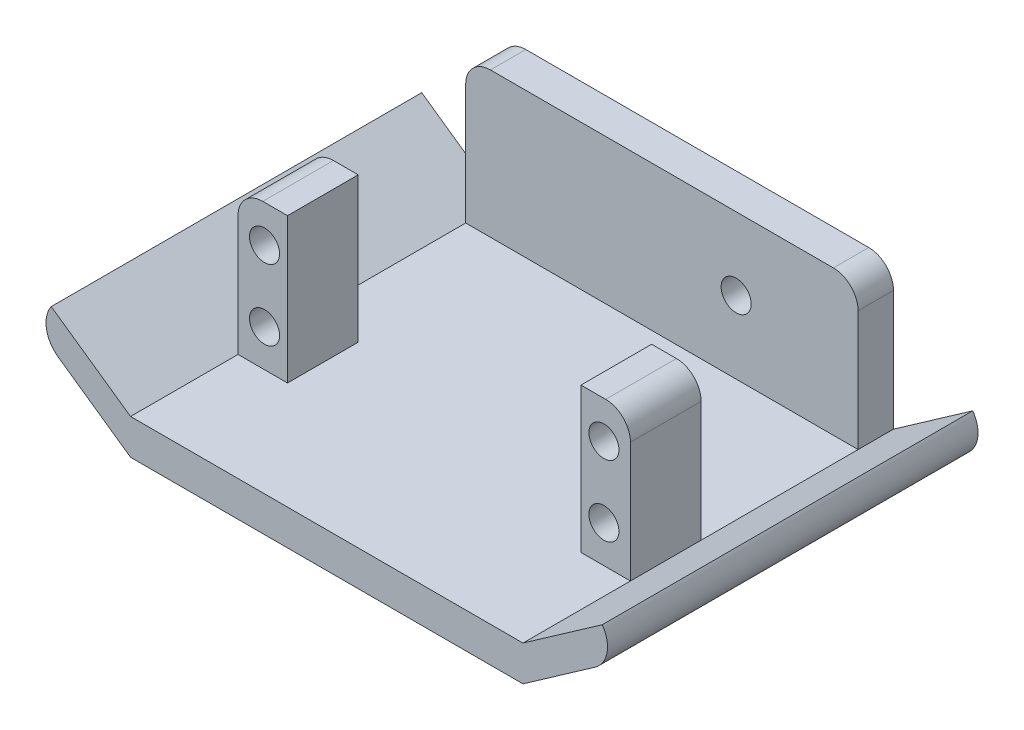
ISO-10303-21;
HEADER;
FILE_DESCRIPTION(('STEP AP214'),'2;1');
FILE_NAME('part.step','',(''),(''),'','','');
FILE_SCHEMA(('AUTOMOTIVE_DESIGN { 1 0 10303 214 1 1 1 1 }'));
ENDSEC;
DATA;
#1=APPLICATION_CONTEXT('core data for automotive mechanical design processes');
#2=APPLICATION_PROTOCOL_DEFINITION('international standard','automotive_design',2000,#1);
#3=PRODUCT_CONTEXT('',#1,'mechanical');
#4=PRODUCT('Part','Part','',(#3));
#5=PRODUCT_RELATED_PRODUCT_CATEGORY('part','',(#4));
#6=PRODUCT_DEFINITION_FORMATION('','',#4);
#7=PRODUCT_DEFINITION_CONTEXT('part definition',#1,'design');
#8=PRODUCT_DEFINITION('design','',#6,#7);
#9=PRODUCT_DEFINITION_SHAPE('','',#8);
#10=(LENGTH_UNIT() NAMED_UNIT(*) SI_UNIT(.MILLI.,.METRE.));
#11=(NAMED_UNIT(*) PLANE_ANGLE_UNIT() SI_UNIT($,.RADIAN.));
#12=(NAMED_UNIT(*) SI_UNIT($,.STERADIAN.) SOLID_ANGLE_UNIT());
#13=UNCERTAINTY_MEASURE_WITH_UNIT(LENGTH_MEASURE(1.E-05),#10,'distance_accuracy_value','');
#14=(GEOMETRIC_REPRESENTATION_CONTEXT(3) GLOBAL_UNCERTAINTY_ASSIGNED_CONTEXT((#13)) GLOBAL_UNIT_ASSIGNED_CONTEXT((#10,
#11,#12)) REPRESENTATION_CONTEXT('',''));
#15=CARTESIAN_POINT('',(0.,0.,0.));
#16=DIRECTION('',(0.,0.,1.));
#17=DIRECTION('',(1.,0.,0.));
#18=AXIS2_PLACEMENT_3D('',#15,#16,#17);
#19=CARTESIAN_POINT('',(55.5,5.,0.));
#20=DIRECTION('',(-1.,0.,0.));
#21=DIRECTION('',(0.,0.,1.));
#22=AXIS2_PLACEMENT_3D('',#19,#20,#21);
#23=PLANE('',#22);
#24=DIRECTION('',(0.,-1.,0.));
#25=VECTOR('',#24,1.);
#26=CARTESIAN_POINT('',(55.5,5.,-40.4));
#27=LINE('',#26,#25);
#28=CARTESIAN_POINT('',(55.5,22.,-40.4));
#29=VERTEX_POINT('',#28);
#30=CARTESIAN_POINT('',(55.5,5.,-40.4));
#31=VERTEX_POINT('',#30);
#32=EDGE_CURVE('E376',#29,#31,#27,.T.);
#33=ORIENTED_EDGE('',*,*,#32,.F.);
#34=DIRECTION('',(0.,0.,-1.));
#35=VECTOR('',#34,1.);
#36=CARTESIAN_POINT('',(55.5,22.,-35.4));
#37=LINE('',#36,#35);
#38=CARTESIAN_POINT('',(55.5,22.,-35.4));
#39=VERTEX_POINT('',#38);
#40=EDGE_CURVE('E387',#29,#39,#37,.F.);
#41=ORIENTED_EDGE('',*,*,#40,.T.);
#42=DIRECTION('',(0.,-1.,0.));
#43=VECTOR('',#42,1.);
#44=CARTESIAN_POINT('',(55.5,0.,-35.4));
#45=LINE('',#44,#43);
#46=CARTESIAN_POINT('',(55.5,5.,-35.4));
#47=VERTEX_POINT('',#46);
#48=EDGE_CURVE('E350',#39,#47,#45,.T.);
#49=ORIENTED_EDGE('',*,*,#48,.T.);
#50=DIRECTION('',(0.,0.,1.));
#51=VECTOR('',#50,1.);
#52=CARTESIAN_POINT('',(55.5,5.,-57.9564078321223));
#53=LINE('',#52,#51);
#54=EDGE_CURVE('E300',#31,#47,#53,.T.);
#55=ORIENTED_EDGE('',*,*,#54,.F.);
#56=EDGE_LOOP('',(#33,#41,#49,#55));
#57=FACE_BOUND('',#56,.T.);
#58=ADVANCED_FACE('F38',(#57),#23,.F.);
#59=DIRECTION('',(0.,1.,0.));
#60=VECTOR('',#59,1.);
#61=CARTESIAN_POINT('',(55.5,25.5,-3.2));
#62=LINE('',#61,#60);
#63=CARTESIAN_POINT('',(55.5,5.,-3.2));
#64=VERTEX_POINT('',#63);
#65=CARTESIAN_POINT('',(55.5,22.,-3.2));
#66=VERTEX_POINT('',#65);
#67=EDGE_CURVE('E322',#64,#66,#62,.T.);
#68=ORIENTED_EDGE('',*,*,#67,.F.);
#69=DIRECTION('',(0.,0.,-1.));
#70=VECTOR('',#69,1.);
#71=CARTESIAN_POINT('',(55.5,5.,0.));
#72=LINE('',#71,#70);
#73=CARTESIAN_POINT('',(55.5,5.,-13.2));
#74=VERTEX_POINT('',#73);
#75=EDGE_CURVE('E370',#64,#74,#72,.T.);
#76=ORIENTED_EDGE('',*,*,#75,.T.);
#77=DIRECTION('',(0.,-1.,0.));
#78=VECTOR('',#77,1.);
#79=CARTESIAN_POINT('',(55.5,22.,-13.2));
#80=LINE('',#79,#78);
#81=CARTESIAN_POINT('',(55.5,22.,-13.2));
#82=VERTEX_POINT('',#81);
#83=EDGE_CURVE('E272',#82,#74,#80,.T.);
#84=ORIENTED_EDGE('',*,*,#83,.F.);
#85=DIRECTION('',(0.,0.,-1.));
#86=VECTOR('',#85,1.);
#87=CARTESIAN_POINT('',(55.5,22.,0.));
#88=LINE('',#87,#86);
#89=EDGE_CURVE('E395',#82,#66,#88,.F.);
#90=ORIENTED_EDGE('',*,*,#89,.T.);
#91=EDGE_LOOP('',(#68,#76,#84,#90));
#92=FACE_BOUND('',#91,.T.);
#93=ADVANCED_FACE('F452',(#92),#23,.F.);
#94=CARTESIAN_POINT('',(0.,5.,0.));
#95=DIRECTION('',(1.,0.,0.));
#96=DIRECTION('',(0.,0.,-1.));
#97=AXIS2_PLACEMENT_3D('',#94,#95,#96);
#98=PLANE('',#97);
#99=DIRECTION('',(0.,1.,0.));
#100=VECTOR('',#99,1.);
#101=CARTESIAN_POINT('',(0.,0.,-35.4));
#102=LINE('',#101,#100);
#103=CARTESIAN_POINT('',(0.,5.,-35.4));
#104=VERTEX_POINT('',#103);
#105=CARTESIAN_POINT('',(0.,22.,-35.4));
#106=VERTEX_POINT('',#105);
#107=EDGE_CURVE('E353',#104,#106,#102,.T.);
#108=ORIENTED_EDGE('',*,*,#107,.T.);
#109=DIRECTION('',(0.,0.,-1.));
#110=VECTOR('',#109,1.);
#111=CARTESIAN_POINT('',(0.,22.,-40.4));
#112=LINE('',#111,#110);
#113=CARTESIAN_POINT('',(0.,22.,-40.4));
#114=VERTEX_POINT('',#113);
#115=EDGE_CURVE('E399',#106,#114,#112,.T.);
#116=ORIENTED_EDGE('',*,*,#115,.T.);
#117=DIRECTION('',(0.,-1.,0.));
#118=VECTOR('',#117,1.);
#119=CARTESIAN_POINT('',(0.,5.,-40.4));
#120=LINE('',#119,#118);
#121=CARTESIAN_POINT('',(0.,5.,-40.4));
#122=VERTEX_POINT('',#121);
#123=EDGE_CURVE('E369',#114,#122,#120,.T.);
#124=ORIENTED_EDGE('',*,*,#123,.T.);
#125=DIRECTION('',(0.,0.,1.));
#126=VECTOR('',#125,1.);
#127=CARTESIAN_POINT('',(0.,5.,-57.9564078321223));
#128=LINE('',#127,#126);
#129=EDGE_CURVE('E309',#122,#104,#128,.T.);
#130=ORIENTED_EDGE('',*,*,#129,.T.);
#131=EDGE_LOOP('',(#108,#116,#124,#130));
#132=FACE_BOUND('',#131,.T.);
#133=ADVANCED_FACE('F430',(#132),#98,.F.);
#134=CARTESIAN_POINT('',(0.,5.,0.));
#135=DIRECTION('',(0.,-1.,0.));
#136=DIRECTION('',(0.,0.,-1.));
#137=AXIS2_PLACEMENT_3D('',#134,#135,#136);
#138=PLANE('',#137);
#139=DIRECTION('',(0.,0.,1.));
#140=VECTOR('',#139,1.);
#141=CARTESIAN_POINT('',(0.,5.,0.));
#142=LINE('',#141,#140);
#143=CARTESIAN_POINT('',(0.,5.,-13.2));
#144=VERTEX_POINT('',#143);
#145=EDGE_CURVE('E363',#104,#144,#142,.T.);
#146=ORIENTED_EDGE('',*,*,#145,.T.);
#147=DIRECTION('',(-1.,0.,0.));
#148=VECTOR('',#147,1.);
#149=CARTESIAN_POINT('',(7.,5.,-13.2));
#150=LINE('',#149,#148);
#151=CARTESIAN_POINT('',(7.,5.,-13.2));
#152=VERTEX_POINT('',#151);
#153=EDGE_CURVE('E242',#152,#144,#150,.T.);
#154=ORIENTED_EDGE('',*,*,#153,.F.);
#155=DIRECTION('',(0.,0.,-1.));
#156=VECTOR('',#155,1.);
#157=CARTESIAN_POINT('',(7.,5.,-3.2));
#158=LINE('',#157,#156);
#159=CARTESIAN_POINT('',(7.,5.,-3.2));
#160=VERTEX_POINT('',#159);
#161=EDGE_CURVE('E53',#160,#152,#158,.T.);
#162=ORIENTED_EDGE('',*,*,#161,.F.);
#163=DIRECTION('',(1.,0.,0.));
#164=VECTOR('',#163,1.);
#165=CARTESIAN_POINT('',(0.,5.,-3.2));
#166=LINE('',#165,#164);
#167=CARTESIAN_POINT('',(0.,5.,-3.2));
#168=VERTEX_POINT('',#167);
#169=EDGE_CURVE('E338',#168,#160,#166,.T.);
#170=ORIENTED_EDGE('',*,*,#169,.F.);
#171=CARTESIAN_POINT('',(0.,5.,12.));
#172=VERTEX_POINT('',#171);
#173=EDGE_CURVE('E366',#168,#172,#142,.T.);
#174=ORIENTED_EDGE('',*,*,#173,.T.);
#175=DIRECTION('',(-1.,0.,0.));
#176=VECTOR('',#175,1.);
#177=CARTESIAN_POINT('',(55.5,5.,12.));
#178=LINE('',#177,#176);
#179=CARTESIAN_POINT('',(55.5,5.,12.));
#180=VERTEX_POINT('',#179);
#181=EDGE_CURVE('E230',#180,#172,#178,.T.);
#182=ORIENTED_EDGE('',*,*,#181,.F.);
#183=EDGE_CURVE('E367',#180,#64,#72,.T.);
#184=ORIENTED_EDGE('',*,*,#183,.T.);
#185=DIRECTION('',(1.,0.,0.));
#186=VECTOR('',#185,1.);
#187=CARTESIAN_POINT('',(55.5,5.,-3.2));
#188=LINE('',#187,#186);
#189=CARTESIAN_POINT('',(48.5,5.,-3.2));
#190=VERTEX_POINT('',#189);
#191=EDGE_CURVE('E329',#190,#64,#188,.T.);
#192=ORIENTED_EDGE('',*,*,#191,.F.);
#193=DIRECTION('',(0.,0.,-1.));
#194=VECTOR('',#193,1.);
#195=CARTESIAN_POINT('',(48.5,5.,-3.2));
#196=LINE('',#195,#194);
#197=CARTESIAN_POINT('',(48.5,5.,-13.2));
#198=VERTEX_POINT('',#197);
#199=EDGE_CURVE('E332',#190,#198,#196,.T.);
#200=ORIENTED_EDGE('',*,*,#199,.T.);
#201=DIRECTION('',(-1.,0.,0.));
#202=VECTOR('',#201,1.);
#203=CARTESIAN_POINT('',(55.5,5.,-13.2));
#204=LINE('',#203,#202);
#205=EDGE_CURVE('E275',#74,#198,#204,.T.);
#206=ORIENTED_EDGE('',*,*,#205,.F.);
#207=EDGE_CURVE('E365',#74,#47,#72,.T.);
#208=ORIENTED_EDGE('',*,*,#207,.T.);
#209=DIRECTION('',(-1.,0.,0.));
#210=VECTOR('',#209,1.);
#211=CARTESIAN_POINT('',(0.,5.,-35.4));
#212=LINE('',#211,#210);
#213=EDGE_CURVE('E205',#47,#104,#212,.T.);
#214=ORIENTED_EDGE('',*,*,#213,.T.);
#215=EDGE_LOOP('',(#146,#154,#162,#170,#174,#182,#184,#192,#200,#206,#208,#214));
#216=FACE_BOUND('',#215,.T.);
#217=ADVANCED_FACE('F422',(#216),#138,.F.);
#218=DIRECTION('',(0.,-1.,0.));
#219=VECTOR('',#218,1.);
#220=CARTESIAN_POINT('',(0.,25.5,-3.2));
#221=LINE('',#220,#219);
#222=CARTESIAN_POINT('',(0.,22.,-3.2));
#223=VERTEX_POINT('',#222);
#224=EDGE_CURVE('E336',#223,#168,#221,.T.);
#225=ORIENTED_EDGE('',*,*,#224,.F.);
#226=DIRECTION('',(0.,0.,-1.));
#227=VECTOR('',#226,1.);
#228=CARTESIAN_POINT('',(0.,22.,0.));
#229=LINE('',#228,#227);
#230=CARTESIAN_POINT('',(0.,22.,-13.2));
#231=VERTEX_POINT('',#230);
#232=EDGE_CURVE('E402',#223,#231,#229,.T.);
#233=ORIENTED_EDGE('',*,*,#232,.T.);
#234=DIRECTION('',(0.,1.,0.));
#235=VECTOR('',#234,1.);
#236=CARTESIAN_POINT('',(0.,5.,-13.2));
#237=LINE('',#236,#235);
#238=EDGE_CURVE('E245',#144,#231,#237,.T.);
#239=ORIENTED_EDGE('',*,*,#238,.F.);
#240=EDGE_CURVE('E61',#144,#168,#128,.T.);
#241=ORIENTED_EDGE('',*,*,#240,.T.);
#242=EDGE_LOOP('',(#225,#233,#239,#241));
#243=FACE_BOUND('',#242,.T.);
#244=ADVANCED_FACE('F417',(#243),#98,.F.);
#245=CARTESIAN_POINT('',(0.,5.,-40.4));
#246=DIRECTION('',(0.,0.,1.));
#247=DIRECTION('',(1.,0.,0.));
#248=AXIS2_PLACEMENT_3D('',#245,#246,#247);
#249=PLANE('',#248);
#250=CARTESIAN_POINT('',(38.25,15.25,-40.4));
#251=DIRECTION('',(0.,0.,1.));
#252=DIRECTION('',(1.,0.,0.));
#253=AXIS2_PLACEMENT_3D('',#250,#251,#252);
#254=CIRCLE('',#253,2.125);
#255=CARTESIAN_POINT('',(40.375,15.25,-40.4));
#256=VERTEX_POINT('',#255);
#257=EDGE_CURVE('E279',#256,#256,#254,.T.);
#258=ORIENTED_EDGE('',*,*,#257,.T.);
#259=EDGE_LOOP('',(#258));
#260=FACE_BOUND('',#259,.T.);
#261=DIRECTION('',(1.,0.,0.));
#262=VECTOR('',#261,1.);
#263=CARTESIAN_POINT('',(55.5,25.5,-40.4));
#264=LINE('',#263,#262);
#265=CARTESIAN_POINT('',(3.5,25.5,-40.4));
#266=VERTEX_POINT('',#265);
#267=CARTESIAN_POINT('',(52.,25.5,-40.4));
#268=VERTEX_POINT('',#267);
#269=EDGE_CURVE('E349',#266,#268,#264,.T.);
#270=ORIENTED_EDGE('',*,*,#269,.T.);
#271=CARTESIAN_POINT('',(52.,22.,-40.4));
#272=DIRECTION('',(0.,0.,1.));
#273=DIRECTION('',(1.,0.,0.));
#274=AXIS2_PLACEMENT_3D('',#271,#272,#273);
#275=CIRCLE('',#274,3.5);
#276=EDGE_CURVE('E385',#268,#29,#275,.F.);
#277=ORIENTED_EDGE('',*,*,#276,.T.);
#278=ORIENTED_EDGE('',*,*,#32,.T.);
#279=DIRECTION('',(0.819152044288995,0.573576436351041,0.));
#280=VECTOR('',#279,1.);
#281=CARTESIAN_POINT('',(55.5,5.,-40.4));
#282=LINE('',#281,#280);
#283=CARTESIAN_POINT('',(66.7181745148335,12.8550503602383,-40.4));
#284=VERTEX_POINT('',#283);
#285=EDGE_CURVE('E299',#31,#284,#282,.T.);
#286=ORIENTED_EDGE('',*,*,#285,.T.);
#287=CARTESIAN_POINT('',(63.3572210864302,10.5068612528074,-40.4));
#288=DIRECTION('',(0.,0.,1.));
#289=DIRECTION('',(1.,0.,0.));
#290=AXIS2_PLACEMENT_3D('',#287,#288,#289);
#291=CIRCLE('',#290,4.10000000392109);
#292=CARTESIAN_POINT('',(65.7088844777185,7.14833786801052,-40.4));
#293=VERTEX_POINT('',#292);
#294=EDGE_CURVE('E297',#284,#293,#291,.F.);
#295=ORIENTED_EDGE('',*,*,#294,.T.);
#296=DIRECTION('',(-0.819152044288995,-0.573576436351042,0.));
#297=VECTOR('',#296,1.);
#298=CARTESIAN_POINT('',(55.5,0.,-40.4));
#299=LINE('',#298,#297);
#300=CARTESIAN_POINT('',(55.5,0.,-40.4));
#301=VERTEX_POINT('',#300);
#302=EDGE_CURVE('E302',#293,#301,#299,.T.);
#303=ORIENTED_EDGE('',*,*,#302,.T.);
#304=DIRECTION('',(-1.,0.,0.));
#305=VECTOR('',#304,1.);
#306=CARTESIAN_POINT('',(0.,0.,-40.4));
#307=LINE('',#306,#305);
#308=CARTESIAN_POINT('',(0.,0.,-40.4));
#309=VERTEX_POINT('',#308);
#310=EDGE_CURVE('E373',#301,#309,#307,.T.);
#311=ORIENTED_EDGE('',*,*,#310,.T.);
#312=DIRECTION('',(-0.819152044288995,0.573576436351041,0.));
#313=VECTOR('',#312,1.);
#314=CARTESIAN_POINT('',(0.,0.,-40.4));
#315=LINE('',#314,#313);
#316=CARTESIAN_POINT('',(-10.2088844777185,7.14833786801052,-40.4));
#317=VERTEX_POINT('',#316);
#318=EDGE_CURVE('E200',#309,#317,#315,.T.);
#319=ORIENTED_EDGE('',*,*,#318,.T.);
#320=CARTESIAN_POINT('',(-7.85722108643022,10.5068612528074,-40.4));
#321=DIRECTION('',(0.,0.,1.));
#322=DIRECTION('',(1.,0.,0.));
#323=AXIS2_PLACEMENT_3D('',#320,#321,#322);
#324=CIRCLE('',#323,4.10000000392109);
#325=CARTESIAN_POINT('',(-11.2181745148335,12.8550503602383,-40.4));
#326=VERTEX_POINT('',#325);
#327=EDGE_CURVE('E310',#317,#326,#324,.F.);
#328=ORIENTED_EDGE('',*,*,#327,.T.);
#329=DIRECTION('',(0.819152044288995,-0.573576436351041,0.));
#330=VECTOR('',#329,1.);
#331=CARTESIAN_POINT('',(0.,5.,-40.4));
#332=LINE('',#331,#330);
#333=EDGE_CURVE('E314',#326,#122,#332,.T.);
#334=ORIENTED_EDGE('',*,*,#333,.T.);
#335=ORIENTED_EDGE('',*,*,#123,.F.);
#336=CARTESIAN_POINT('',(3.5,22.,-40.4));
#337=DIRECTION('',(0.,0.,1.));
#338=DIRECTION('',(1.,0.,0.));
#339=AXIS2_PLACEMENT_3D('',#336,#337,#338);
#340=CIRCLE('',#339,3.5);
#341=EDGE_CURVE('E383',#114,#266,#340,.F.);
#342=ORIENTED_EDGE('',*,*,#341,.T.);
#343=EDGE_LOOP('',(#270,#277,#278,#286,#295,#303,#311,#319,#328,#334,#335,#342));
#344=FACE_BOUND('',#343,.T.);
#345=ADVANCED_FACE('F434',(#260,#344),#249,.F.);
#346=CARTESIAN_POINT('',(0.,0.,0.));
#347=DIRECTION('',(0.,-1.,0.));
#348=DIRECTION('',(0.,0.,-1.));
#349=AXIS2_PLACEMENT_3D('',#346,#347,#348);
#350=PLANE('',#349);
#351=DIRECTION('',(0.,0.,-1.));
#352=VECTOR('',#351,1.);
#353=CARTESIAN_POINT('',(55.5,0.,0.));
#354=LINE('',#353,#352);
#355=CARTESIAN_POINT('',(55.5,0.,12.));
#356=VERTEX_POINT('',#355);
#357=EDGE_CURVE('E204',#356,#301,#354,.T.);
#358=ORIENTED_EDGE('',*,*,#357,.F.);
#359=DIRECTION('',(1.,0.,0.));
#360=VECTOR('',#359,1.);
#361=CARTESIAN_POINT('',(0.,0.,12.));
#362=LINE('',#361,#360);
#363=CARTESIAN_POINT('',(0.,0.,12.));
#364=VERTEX_POINT('',#363);
#365=EDGE_CURVE('E208',#364,#356,#362,.T.);
#366=ORIENTED_EDGE('',*,*,#365,.F.);
#367=DIRECTION('',(0.,0.,1.));
#368=VECTOR('',#367,1.);
#369=CARTESIAN_POINT('',(0.,0.,0.));
#370=LINE('',#369,#368);
#371=EDGE_CURVE('E194',#309,#364,#370,.T.);
#372=ORIENTED_EDGE('',*,*,#371,.F.);
#373=ORIENTED_EDGE('',*,*,#310,.F.);
#374=EDGE_LOOP('',(#358,#366,#372,#373));
#375=FACE_BOUND('',#374,.T.);
#376=ADVANCED_FACE('F209',(#375),#350,.T.);
#377=CARTESIAN_POINT('',(0.,0.,-35.4));
#378=DIRECTION('',(0.,0.,1.));
#379=DIRECTION('',(1.,0.,0.));
#380=AXIS2_PLACEMENT_3D('',#377,#378,#379);
#381=PLANE('',#380);
#382=CARTESIAN_POINT('',(38.25,15.25,-35.4));
#383=DIRECTION('',(0.,0.,1.));
#384=DIRECTION('',(1.,0.,0.));
#385=AXIS2_PLACEMENT_3D('',#382,#383,#384);
#386=CIRCLE('',#385,2.125);
#387=CARTESIAN_POINT('',(40.375,15.25,-35.4));
#388=VERTEX_POINT('',#387);
#389=EDGE_CURVE('E278',#388,#388,#386,.T.);
#390=ORIENTED_EDGE('',*,*,#389,.F.);
#391=EDGE_LOOP('',(#390));
#392=FACE_BOUND('',#391,.T.);
#393=ORIENTED_EDGE('',*,*,#48,.F.);
#394=CARTESIAN_POINT('',(52.,22.,-35.4));
#395=DIRECTION('',(0.,0.,1.));
#396=DIRECTION('',(1.,0.,0.));
#397=AXIS2_PLACEMENT_3D('',#394,#395,#396);
#398=CIRCLE('',#397,3.5);
#399=CARTESIAN_POINT('',(52.,25.5,-35.4));
#400=VERTEX_POINT('',#399);
#401=EDGE_CURVE('E391',#39,#400,#398,.T.);
#402=ORIENTED_EDGE('',*,*,#401,.T.);
#403=DIRECTION('',(1.,0.,0.));
#404=VECTOR('',#403,1.);
#405=CARTESIAN_POINT('',(55.5,25.5,-35.4));
#406=LINE('',#405,#404);
#407=CARTESIAN_POINT('',(3.5,25.5,-35.4));
#408=VERTEX_POINT('',#407);
#409=EDGE_CURVE('E356',#408,#400,#406,.T.);
#410=ORIENTED_EDGE('',*,*,#409,.F.);
#411=CARTESIAN_POINT('',(3.5,22.,-35.4));
#412=DIRECTION('',(0.,0.,1.));
#413=DIRECTION('',(1.,0.,0.));
#414=AXIS2_PLACEMENT_3D('',#411,#412,#413);
#415=CIRCLE('',#414,3.5);
#416=EDGE_CURVE('E389',#408,#106,#415,.T.);
#417=ORIENTED_EDGE('',*,*,#416,.T.);
#418=ORIENTED_EDGE('',*,*,#107,.F.);
#419=ORIENTED_EDGE('',*,*,#213,.F.);
#420=EDGE_LOOP('',(#393,#402,#410,#417,#418,#419));
#421=FACE_BOUND('',#420,.T.);
#422=ADVANCED_FACE('F485',(#392,#421),#381,.T.);
#423=CARTESIAN_POINT('',(55.5,25.5,-35.4));
#424=DIRECTION('',(0.,1.,0.));
#425=DIRECTION('',(0.,0.,1.));
#426=AXIS2_PLACEMENT_3D('',#423,#424,#425);
#427=PLANE('',#426);
#428=ORIENTED_EDGE('',*,*,#409,.T.);
#429=DIRECTION('',(0.,0.,-1.));
#430=VECTOR('',#429,1.);
#431=CARTESIAN_POINT('',(52.,25.5,-40.4));
#432=LINE('',#431,#430);
#433=EDGE_CURVE('E380',#400,#268,#432,.T.);
#434=ORIENTED_EDGE('',*,*,#433,.T.);
#435=ORIENTED_EDGE('',*,*,#269,.F.);
#436=DIRECTION('',(0.,0.,-1.));
#437=VECTOR('',#436,1.);
#438=CARTESIAN_POINT('',(3.5,25.5,-35.4));
#439=LINE('',#438,#437);
#440=EDGE_CURVE('E378',#266,#408,#439,.F.);
#441=ORIENTED_EDGE('',*,*,#440,.T.);
#442=EDGE_LOOP('',(#428,#434,#435,#441));
#443=FACE_BOUND('',#442,.T.);
#444=ADVANCED_FACE('F489',(#443),#427,.T.);
#445=CARTESIAN_POINT('',(7.,25.5,-3.2));
#446=DIRECTION('',(-1.,0.,0.));
#447=DIRECTION('',(0.,-1.,0.));
#448=AXIS2_PLACEMENT_3D('',#445,#446,#447);
#449=PLANE('',#448);
#450=ORIENTED_EDGE('',*,*,#161,.T.);
#451=DIRECTION('',(0.,-1.,0.));
#452=VECTOR('',#451,1.);
#453=CARTESIAN_POINT('',(7.,25.5,-13.2));
#454=LINE('',#453,#452);
#455=CARTESIAN_POINT('',(7.,25.5,-13.2));
#456=VERTEX_POINT('',#455);
#457=EDGE_CURVE('E254',#456,#152,#454,.T.);
#458=ORIENTED_EDGE('',*,*,#457,.F.);
#459=DIRECTION('',(0.,0.,-1.));
#460=VECTOR('',#459,1.);
#461=CARTESIAN_POINT('',(7.,25.5,-3.2));
#462=LINE('',#461,#460);
#463=CARTESIAN_POINT('',(7.,25.5,-3.2));
#464=VERTEX_POINT('',#463);
#465=EDGE_CURVE('E346',#464,#456,#462,.T.);
#466=ORIENTED_EDGE('',*,*,#465,.F.);
#467=DIRECTION('',(0.,1.,0.));
#468=VECTOR('',#467,1.);
#469=CARTESIAN_POINT('',(7.,25.5,-3.2));
#470=LINE('',#469,#468);
#471=EDGE_CURVE('E341',#160,#464,#470,.T.);
#472=ORIENTED_EDGE('',*,*,#471,.F.);
#473=EDGE_LOOP('',(#450,#458,#466,#472));
#474=FACE_BOUND('',#473,.T.);
#475=ADVANCED_FACE('F508',(#474),#449,.F.);
#476=CARTESIAN_POINT('',(0.,25.5,-3.2));
#477=DIRECTION('',(0.,-1.,0.));
#478=DIRECTION('',(0.,0.,-1.));
#479=AXIS2_PLACEMENT_3D('',#476,#477,#478);
#480=PLANE('',#479);
#481=ORIENTED_EDGE('',*,*,#465,.T.);
#482=DIRECTION('',(1.,0.,0.));
#483=VECTOR('',#482,1.);
#484=CARTESIAN_POINT('',(3.5,25.5,-13.2));
#485=LINE('',#484,#483);
#486=CARTESIAN_POINT('',(3.5,25.5,-13.2));
#487=VERTEX_POINT('',#486);
#488=EDGE_CURVE('E251',#487,#456,#485,.T.);
#489=ORIENTED_EDGE('',*,*,#488,.F.);
#490=DIRECTION('',(0.,0.,-1.));
#491=VECTOR('',#490,1.);
#492=CARTESIAN_POINT('',(3.5,25.5,-3.2));
#493=LINE('',#492,#491);
#494=CARTESIAN_POINT('',(3.5,25.5,-3.2));
#495=VERTEX_POINT('',#494);
#496=EDGE_CURVE('E46',#487,#495,#493,.F.);
#497=ORIENTED_EDGE('',*,*,#496,.T.);
#498=DIRECTION('',(-1.,0.,0.));
#499=VECTOR('',#498,1.);
#500=CARTESIAN_POINT('',(0.,25.5,-3.2));
#501=LINE('',#500,#499);
#502=EDGE_CURVE('E343',#464,#495,#501,.T.);
#503=ORIENTED_EDGE('',*,*,#502,.F.);
#504=EDGE_LOOP('',(#481,#489,#497,#503));
#505=FACE_BOUND('',#504,.T.);
#506=ADVANCED_FACE('F406',(#505),#480,.F.);
#507=CARTESIAN_POINT('',(0.,0.,-3.2));
#508=DIRECTION('',(0.,0.,1.));
#509=DIRECTION('',(1.,0.,0.));
#510=AXIS2_PLACEMENT_3D('',#507,#508,#509);
#511=PLANE('',#510);
#512=CARTESIAN_POINT('',(3.75,10.25,-3.2));
#513=DIRECTION('',(0.,0.,1.));
#514=DIRECTION('',(-1.,0.,0.));
#515=AXIS2_PLACEMENT_3D('',#512,#513,#514);
#516=CIRCLE('',#515,2.125);
#517=CARTESIAN_POINT('',(1.625,10.25,-3.2));
#518=VERTEX_POINT('',#517);
#519=EDGE_CURVE('E285',#518,#518,#516,.T.);
#520=ORIENTED_EDGE('',*,*,#519,.F.);
#521=EDGE_LOOP('',(#520));
#522=FACE_BOUND('',#521,.T.);
#523=CARTESIAN_POINT('',(3.75,20.25,-3.2));
#524=DIRECTION('',(0.,0.,1.));
#525=DIRECTION('',(1.,0.,0.));
#526=AXIS2_PLACEMENT_3D('',#523,#524,#525);
#527=CIRCLE('',#526,2.125);
#528=CARTESIAN_POINT('',(5.875,20.25,-3.2));
#529=VERTEX_POINT('',#528);
#530=EDGE_CURVE('E288',#529,#529,#527,.T.);
#531=ORIENTED_EDGE('',*,*,#530,.F.);
#532=EDGE_LOOP('',(#531));
#533=FACE_BOUND('',#532,.T.);
#534=ORIENTED_EDGE('',*,*,#502,.T.);
#535=CARTESIAN_POINT('',(3.5,22.,-3.2));
#536=DIRECTION('',(0.,0.,1.));
#537=DIRECTION('',(1.,0.,0.));
#538=AXIS2_PLACEMENT_3D('',#535,#536,#537);
#539=CIRCLE('',#538,3.5);
#540=EDGE_CURVE('E11',#495,#223,#539,.T.);
#541=ORIENTED_EDGE('',*,*,#540,.T.);
#542=ORIENTED_EDGE('',*,*,#224,.T.);
#543=ORIENTED_EDGE('',*,*,#169,.T.);
#544=ORIENTED_EDGE('',*,*,#471,.T.);
#545=EDGE_LOOP('',(#534,#541,#542,#543,#544));
#546=FACE_BOUND('',#545,.T.);
#547=ADVANCED_FACE('F411',(#522,#533,#546),#511,.T.);
#548=CARTESIAN_POINT('',(55.5,25.5,-3.2));
#549=DIRECTION('',(0.,-1.,0.));
#550=DIRECTION('',(0.,0.,-1.));
#551=AXIS2_PLACEMENT_3D('',#548,#549,#550);
#552=PLANE('',#551);
#553=DIRECTION('',(-1.,0.,0.));
#554=VECTOR('',#553,1.);
#555=CARTESIAN_POINT('',(55.5,25.5,-3.2));
#556=LINE('',#555,#554);
#557=CARTESIAN_POINT('',(52.,25.5,-3.2));
#558=VERTEX_POINT('',#557);
#559=CARTESIAN_POINT('',(48.5,25.5,-3.2));
#560=VERTEX_POINT('',#559);
#561=EDGE_CURVE('E325',#558,#560,#556,.T.);
#562=ORIENTED_EDGE('',*,*,#561,.F.);
#563=DIRECTION('',(0.,0.,-1.));
#564=VECTOR('',#563,1.);
#565=CARTESIAN_POINT('',(52.,25.5,-3.2));
#566=LINE('',#565,#564);
#567=CARTESIAN_POINT('',(52.,25.5,-13.2));
#568=VERTEX_POINT('',#567);
#569=EDGE_CURVE('E393',#558,#568,#566,.T.);
#570=ORIENTED_EDGE('',*,*,#569,.T.);
#571=DIRECTION('',(1.,0.,0.));
#572=VECTOR('',#571,1.);
#573=CARTESIAN_POINT('',(48.5,25.5,-13.2));
#574=LINE('',#573,#572);
#575=CARTESIAN_POINT('',(48.5,25.5,-13.2));
#576=VERTEX_POINT('',#575);
#577=EDGE_CURVE('E266',#576,#568,#574,.T.);
#578=ORIENTED_EDGE('',*,*,#577,.F.);
#579=DIRECTION('',(0.,0.,-1.));
#580=VECTOR('',#579,1.);
#581=CARTESIAN_POINT('',(48.5,25.5,-3.2));
#582=LINE('',#581,#580);
#583=EDGE_CURVE('E334',#560,#576,#582,.T.);
#584=ORIENTED_EDGE('',*,*,#583,.F.);
#585=EDGE_LOOP('',(#562,#570,#578,#584));
#586=FACE_BOUND('',#585,.T.);
#587=ADVANCED_FACE('F753',(#586),#552,.F.);
#588=CARTESIAN_POINT('',(48.5,25.5,-3.2));
#589=DIRECTION('',(1.,0.,0.));
#590=DIRECTION('',(0.,1.,0.));
#591=AXIS2_PLACEMENT_3D('',#588,#589,#590);
#592=PLANE('',#591);
#593=ORIENTED_EDGE('',*,*,#583,.T.);
#594=DIRECTION('',(0.,1.,0.));
#595=VECTOR('',#594,1.);
#596=CARTESIAN_POINT('',(48.5,5.,-13.2));
#597=LINE('',#596,#595);
#598=EDGE_CURVE('E263',#198,#576,#597,.T.);
#599=ORIENTED_EDGE('',*,*,#598,.F.);
#600=ORIENTED_EDGE('',*,*,#199,.F.);
#601=DIRECTION('',(0.,-1.,0.));
#602=VECTOR('',#601,1.);
#603=CARTESIAN_POINT('',(48.5,25.5,-3.2));
#604=LINE('',#603,#602);
#605=EDGE_CURVE('E327',#560,#190,#604,.T.);
#606=ORIENTED_EDGE('',*,*,#605,.F.);
#607=EDGE_LOOP('',(#593,#599,#600,#606));
#608=FACE_BOUND('',#607,.T.);
#609=ADVANCED_FACE('F758',(#608),#592,.F.);
#610=CARTESIAN_POINT('',(0.,0.,-3.2));
#611=DIRECTION('',(0.,0.,-1.));
#612=DIRECTION('',(-1.,0.,0.));
#613=AXIS2_PLACEMENT_3D('',#610,#611,#612);
#614=PLANE('',#613);
#615=CARTESIAN_POINT('',(51.75,20.25,-3.2));
#616=DIRECTION('',(0.,0.,1.));
#617=DIRECTION('',(-1.,0.,0.));
#618=AXIS2_PLACEMENT_3D('',#615,#616,#617);
#619=CIRCLE('',#618,2.125);
#620=CARTESIAN_POINT('',(49.625,20.25,-3.2));
#621=VERTEX_POINT('',#620);
#622=EDGE_CURVE('E282',#621,#621,#619,.T.);
#623=ORIENTED_EDGE('',*,*,#622,.F.);
#624=EDGE_LOOP('',(#623));
#625=FACE_BOUND('',#624,.T.);
#626=CARTESIAN_POINT('',(51.75,10.25,-3.2));
#627=DIRECTION('',(0.,0.,1.));
#628=DIRECTION('',(1.,0.,0.));
#629=AXIS2_PLACEMENT_3D('',#626,#627,#628);
#630=CIRCLE('',#629,2.125);
#631=CARTESIAN_POINT('',(53.875,10.25,-3.2));
#632=VERTEX_POINT('',#631);
#633=EDGE_CURVE('E289',#632,#632,#630,.T.);
#634=ORIENTED_EDGE('',*,*,#633,.F.);
#635=EDGE_LOOP('',(#634));
#636=FACE_BOUND('',#635,.T.);
#637=ORIENTED_EDGE('',*,*,#67,.T.);
#638=CARTESIAN_POINT('',(52.,22.,-3.2));
#639=DIRECTION('',(0.,0.,-1.));
#640=DIRECTION('',(-1.,0.,0.));
#641=AXIS2_PLACEMENT_3D('',#638,#639,#640);
#642=CIRCLE('',#641,3.5);
#643=EDGE_CURVE('E397',#66,#558,#642,.F.);
#644=ORIENTED_EDGE('',*,*,#643,.T.);
#645=ORIENTED_EDGE('',*,*,#561,.T.);
#646=ORIENTED_EDGE('',*,*,#605,.T.);
#647=ORIENTED_EDGE('',*,*,#191,.T.);
#648=EDGE_LOOP('',(#637,#644,#645,#646,#647));
#649=FACE_BOUND('',#648,.T.);
#650=ADVANCED_FACE('F449',(#625,#636,#649),#614,.F.);
#651=CARTESIAN_POINT('',(0.,0.,-57.9564078321223));
#652=DIRECTION('',(-0.573576436351041,-0.819152044288995,0.));
#653=DIRECTION('',(0.819152044288995,-0.573576436351041,0.));
#654=AXIS2_PLACEMENT_3D('',#651,#652,#653);
#655=PLANE('',#654);
#656=ORIENTED_EDGE('',*,*,#318,.F.);
#657=ORIENTED_EDGE('',*,*,#371,.T.);
#658=DIRECTION('',(0.819152044288995,-0.573576436351041,0.));
#659=VECTOR('',#658,1.);
#660=CARTESIAN_POINT('',(-10.2088844777185,7.14833786801052,12.));
#661=LINE('',#660,#659);
#662=CARTESIAN_POINT('',(-10.2088844777185,7.14833786801053,12.));
#663=VERTEX_POINT('',#662);
#664=EDGE_CURVE('E199',#663,#364,#661,.T.);
#665=ORIENTED_EDGE('',*,*,#664,.F.);
#666=DIRECTION('',(0.,0.,1.));
#667=VECTOR('',#666,1.);
#668=CARTESIAN_POINT('',(-10.2088844777185,7.14833786801052,-57.9564078321223));
#669=LINE('',#668,#667);
#670=EDGE_CURVE('E312',#317,#663,#669,.T.);
#671=ORIENTED_EDGE('',*,*,#670,.F.);
#672=EDGE_LOOP('',(#656,#657,#665,#671));
#673=FACE_BOUND('',#672,.T.);
#674=ADVANCED_FACE('F196',(#673),#655,.T.);
#675=CARTESIAN_POINT('',(-7.85722108643022,10.5068612528074,-57.9564078321223));
#676=DIRECTION('',(0.,0.,1.));
#677=DIRECTION('',(1.,0.,0.));
#678=AXIS2_PLACEMENT_3D('',#675,#676,#677);
#679=CYLINDRICAL_SURFACE('',#678,4.10000000392109);
#680=ORIENTED_EDGE('',*,*,#327,.F.);
#681=ORIENTED_EDGE('',*,*,#670,.T.);
#682=CARTESIAN_POINT('',(-7.85722108643022,10.5068612528074,12.));
#683=DIRECTION('',(0.,0.,1.));
#684=DIRECTION('',(1.,0.,0.));
#685=AXIS2_PLACEMENT_3D('',#682,#683,#684);
#686=CIRCLE('',#685,4.10000000392109);
#687=CARTESIAN_POINT('',(-11.2181745148335,12.8550503602383,12.));
#688=VERTEX_POINT('',#687);
#689=EDGE_CURVE('E220',#688,#663,#686,.T.);
#690=ORIENTED_EDGE('',*,*,#689,.F.);
#691=DIRECTION('',(0.,0.,1.));
#692=VECTOR('',#691,1.);
#693=CARTESIAN_POINT('',(-11.2181745148335,12.8550503602383,-57.9564078321223));
#694=LINE('',#693,#692);
#695=EDGE_CURVE('E316',#326,#688,#694,.T.);
#696=ORIENTED_EDGE('',*,*,#695,.F.);
#697=EDGE_LOOP('',(#680,#681,#690,#696));
#698=FACE_BOUND('',#697,.T.);
#699=ADVANCED_FACE('F440',(#698),#679,.T.);
#700=CARTESIAN_POINT('',(0.,5.,-57.9564078321223));
#701=DIRECTION('',(0.573576436351041,0.819152044288995,0.));
#702=DIRECTION('',(-0.819152044288995,0.573576436351041,0.));
#703=AXIS2_PLACEMENT_3D('',#700,#701,#702);
#704=PLANE('',#703);
#705=ORIENTED_EDGE('',*,*,#333,.F.);
#706=ORIENTED_EDGE('',*,*,#695,.T.);
#707=DIRECTION('',(-0.819152044288995,0.573576436351041,0.));
#708=VECTOR('',#707,1.);
#709=CARTESIAN_POINT('',(0.,5.,12.));
#710=LINE('',#709,#708);
#711=EDGE_CURVE('E233',#172,#688,#710,.T.);
#712=ORIENTED_EDGE('',*,*,#711,.F.);
#713=ORIENTED_EDGE('',*,*,#173,.F.);
#714=ORIENTED_EDGE('',*,*,#240,.F.);
#715=ORIENTED_EDGE('',*,*,#145,.F.);
#716=ORIENTED_EDGE('',*,*,#129,.F.);
#717=EDGE_LOOP('',(#705,#706,#712,#713,#714,#715,#716));
#718=FACE_BOUND('',#717,.T.);
#719=ADVANCED_FACE('F428',(#718),#704,.T.);
#720=CARTESIAN_POINT('',(55.5,5.,-57.9564078321223));
#721=DIRECTION('',(-0.573576436351041,0.819152044288995,0.));
#722=DIRECTION('',(-0.819152044288995,-0.573576436351041,0.));
#723=AXIS2_PLACEMENT_3D('',#720,#721,#722);
#724=PLANE('',#723);
#725=ORIENTED_EDGE('',*,*,#285,.F.);
#726=ORIENTED_EDGE('',*,*,#54,.T.);
#727=ORIENTED_EDGE('',*,*,#207,.F.);
#728=ORIENTED_EDGE('',*,*,#75,.F.);
#729=ORIENTED_EDGE('',*,*,#183,.F.);
#730=DIRECTION('',(-0.819152044288995,-0.573576436351041,0.));
#731=VECTOR('',#730,1.);
#732=CARTESIAN_POINT('',(66.7181745148335,12.8550503602383,12.));
#733=LINE('',#732,#731);
#734=CARTESIAN_POINT('',(66.7181745148335,12.8550503602383,12.));
#735=VERTEX_POINT('',#734);
#736=EDGE_CURVE('E227',#735,#180,#733,.T.);
#737=ORIENTED_EDGE('',*,*,#736,.F.);
#738=DIRECTION('',(0.,0.,1.));
#739=VECTOR('',#738,1.);
#740=CARTESIAN_POINT('',(66.7181745148335,12.8550503602383,-57.9564078321223));
#741=LINE('',#740,#739);
#742=EDGE_CURVE('E305',#284,#735,#741,.T.);
#743=ORIENTED_EDGE('',*,*,#742,.F.);
#744=EDGE_LOOP('',(#725,#726,#727,#728,#729,#737,#743));
#745=FACE_BOUND('',#744,.T.);
#746=ADVANCED_FACE('F447',(#745),#724,.T.);
#747=CARTESIAN_POINT('',(63.3572210864302,10.5068612528074,-57.9564078321223));
#748=DIRECTION('',(0.,0.,1.));
#749=DIRECTION('',(1.,0.,0.));
#750=AXIS2_PLACEMENT_3D('',#747,#748,#749);
#751=CYLINDRICAL_SURFACE('',#750,4.10000000392109);
#752=ORIENTED_EDGE('',*,*,#294,.F.);
#753=ORIENTED_EDGE('',*,*,#742,.T.);
#754=CARTESIAN_POINT('',(63.3572210864302,10.5068612528074,12.));
#755=DIRECTION('',(0.,0.,1.));
#756=DIRECTION('',(1.,0.,0.));
#757=AXIS2_PLACEMENT_3D('',#754,#755,#756);
#758=CIRCLE('',#757,4.10000000392109);
#759=CARTESIAN_POINT('',(65.7088844777185,7.14833786801052,12.));
#760=VERTEX_POINT('',#759);
#761=EDGE_CURVE('E224',#760,#735,#758,.T.);
#762=ORIENTED_EDGE('',*,*,#761,.F.);
#763=DIRECTION('',(0.,0.,1.));
#764=VECTOR('',#763,1.);
#765=CARTESIAN_POINT('',(65.7088844777185,7.14833786801052,-57.9564078321223));
#766=LINE('',#765,#764);
#767=EDGE_CURVE('E296',#293,#760,#766,.T.);
#768=ORIENTED_EDGE('',*,*,#767,.F.);
#769=EDGE_LOOP('',(#752,#753,#762,#768));
#770=FACE_BOUND('',#769,.T.);
#771=ADVANCED_FACE('F501',(#770),#751,.T.);
#772=CARTESIAN_POINT('',(55.5,0.,-57.9564078321223));
#773=DIRECTION('',(0.573576436351042,-0.819152044288995,0.));
#774=DIRECTION('',(0.819152044288995,0.573576436351042,0.));
#775=AXIS2_PLACEMENT_3D('',#772,#773,#774);
#776=PLANE('',#775);
#777=ORIENTED_EDGE('',*,*,#302,.F.);
#778=ORIENTED_EDGE('',*,*,#767,.T.);
#779=DIRECTION('',(0.819152044288995,0.573576436351042,0.));
#780=VECTOR('',#779,1.);
#781=CARTESIAN_POINT('',(55.5,0.,12.));
#782=LINE('',#781,#780);
#783=EDGE_CURVE('E214',#356,#760,#782,.T.);
#784=ORIENTED_EDGE('',*,*,#783,.F.);
#785=ORIENTED_EDGE('',*,*,#357,.T.);
#786=EDGE_LOOP('',(#777,#778,#784,#785));
#787=FACE_BOUND('',#786,.T.);
#788=ADVANCED_FACE('F505',(#787),#776,.T.);
#789=CARTESIAN_POINT('',(51.75,10.25,-8.2));
#790=DIRECTION('',(0.,0.,1.));
#791=DIRECTION('',(1.,0.,0.));
#792=AXIS2_PLACEMENT_3D('',#789,#790,#791);
#793=CYLINDRICAL_SURFACE('',#792,2.125);
#794=ORIENTED_EDGE('',*,*,#633,.T.);
#795=EDGE_LOOP('',(#794));
#796=FACE_BOUND('',#795,.T.);
#797=CARTESIAN_POINT('',(51.75,10.25,-13.2));
#798=DIRECTION('',(0.,0.,-1.));
#799=DIRECTION('',(-1.,0.,0.));
#800=AXIS2_PLACEMENT_3D('',#797,#798,#799);
#801=CIRCLE('',#800,2.125);
#802=CARTESIAN_POINT('',(49.625,10.25,-13.2));
#803=VERTEX_POINT('',#802);
#804=EDGE_CURVE('E257',#803,#803,#801,.T.);
#805=ORIENTED_EDGE('',*,*,#804,.T.);
#806=EDGE_LOOP('',(#805));
#807=FACE_BOUND('',#806,.T.);
#808=ADVANCED_FACE('F548',(#796,#807),#793,.F.);
#809=CARTESIAN_POINT('',(51.75,20.25,-8.2));
#810=DIRECTION('',(0.,0.,1.));
#811=DIRECTION('',(1.,0.,0.));
#812=AXIS2_PLACEMENT_3D('',#809,#810,#811);
#813=CYLINDRICAL_SURFACE('',#812,2.125);
#814=ORIENTED_EDGE('',*,*,#622,.T.);
#815=EDGE_LOOP('',(#814));
#816=FACE_BOUND('',#815,.T.);
#817=CARTESIAN_POINT('',(51.75,20.25,-13.2));
#818=DIRECTION('',(0.,0.,-1.));
#819=DIRECTION('',(-1.,0.,0.));
#820=AXIS2_PLACEMENT_3D('',#817,#818,#819);
#821=CIRCLE('',#820,2.125);
#822=CARTESIAN_POINT('',(49.625,20.25,-13.2));
#823=VERTEX_POINT('',#822);
#824=EDGE_CURVE('E260',#823,#823,#821,.T.);
#825=ORIENTED_EDGE('',*,*,#824,.T.);
#826=EDGE_LOOP('',(#825));
#827=FACE_BOUND('',#826,.T.);
#828=ADVANCED_FACE('F551',(#816,#827),#813,.F.);
#829=CARTESIAN_POINT('',(3.75,20.25,-8.2));
#830=DIRECTION('',(0.,0.,1.));
#831=DIRECTION('',(1.,0.,0.));
#832=AXIS2_PLACEMENT_3D('',#829,#830,#831);
#833=CYLINDRICAL_SURFACE('',#832,2.125);
#834=ORIENTED_EDGE('',*,*,#530,.T.);
#835=EDGE_LOOP('',(#834));
#836=FACE_BOUND('',#835,.T.);
#837=CARTESIAN_POINT('',(3.75,20.25,-13.2));
#838=DIRECTION('',(0.,0.,-1.));
#839=DIRECTION('',(-1.,0.,0.));
#840=AXIS2_PLACEMENT_3D('',#837,#838,#839);
#841=CIRCLE('',#840,2.125);
#842=CARTESIAN_POINT('',(1.625,20.25,-13.2));
#843=VERTEX_POINT('',#842);
#844=EDGE_CURVE('E236',#843,#843,#841,.T.);
#845=ORIENTED_EDGE('',*,*,#844,.T.);
#846=EDGE_LOOP('',(#845));
#847=FACE_BOUND('',#846,.T.);
#848=ADVANCED_FACE('F546',(#836,#847),#833,.F.);
#849=CARTESIAN_POINT('',(3.75,10.25,-8.2));
#850=DIRECTION('',(0.,0.,1.));
#851=DIRECTION('',(1.,0.,0.));
#852=AXIS2_PLACEMENT_3D('',#849,#850,#851);
#853=CYLINDRICAL_SURFACE('',#852,2.125);
#854=ORIENTED_EDGE('',*,*,#519,.T.);
#855=EDGE_LOOP('',(#854));
#856=FACE_BOUND('',#855,.T.);
#857=CARTESIAN_POINT('',(3.75,10.25,-13.2));
#858=DIRECTION('',(0.,0.,-1.));
#859=DIRECTION('',(-1.,0.,0.));
#860=AXIS2_PLACEMENT_3D('',#857,#858,#859);
#861=CIRCLE('',#860,2.125);
#862=CARTESIAN_POINT('',(1.625,10.25,-13.2));
#863=VERTEX_POINT('',#862);
#864=EDGE_CURVE('E239',#863,#863,#861,.T.);
#865=ORIENTED_EDGE('',*,*,#864,.T.);
#866=EDGE_LOOP('',(#865));
#867=FACE_BOUND('',#866,.T.);
#868=ADVANCED_FACE('F469',(#856,#867),#853,.F.);
#869=CARTESIAN_POINT('',(52.,22.,-35.4));
#870=DIRECTION('',(0.,0.,1.));
#871=DIRECTION('',(1.,0.,0.));
#872=AXIS2_PLACEMENT_3D('',#869,#870,#871);
#873=CYLINDRICAL_SURFACE('',#872,3.5);
#874=ORIENTED_EDGE('',*,*,#401,.F.);
#875=ORIENTED_EDGE('',*,*,#40,.F.);
#876=ORIENTED_EDGE('',*,*,#276,.F.);
#877=ORIENTED_EDGE('',*,*,#433,.F.);
#878=EDGE_LOOP('',(#874,#875,#876,#877));
#879=FACE_BOUND('',#878,.T.);
#880=ADVANCED_FACE('F465',(#879),#873,.T.);
#881=CARTESIAN_POINT('',(52.,22.,-3.2));
#882=DIRECTION('',(0.,0.,-1.));
#883=DIRECTION('',(-1.,0.,0.));
#884=AXIS2_PLACEMENT_3D('',#881,#882,#883);
#885=CYLINDRICAL_SURFACE('',#884,3.5);
#886=ORIENTED_EDGE('',*,*,#643,.F.);
#887=ORIENTED_EDGE('',*,*,#89,.F.);
#888=CARTESIAN_POINT('',(52.,22.,-13.2));
#889=DIRECTION('',(0.,0.,-1.));
#890=DIRECTION('',(-1.,0.,0.));
#891=AXIS2_PLACEMENT_3D('',#888,#889,#890);
#892=CIRCLE('',#891,3.5);
#893=EDGE_CURVE('E269',#568,#82,#892,.T.);
#894=ORIENTED_EDGE('',*,*,#893,.F.);
#895=ORIENTED_EDGE('',*,*,#569,.F.);
#896=EDGE_LOOP('',(#886,#887,#894,#895));
#897=FACE_BOUND('',#896,.T.);
#898=ADVANCED_FACE('F468',(#897),#885,.T.);
#899=CARTESIAN_POINT('',(3.5,22.,0.));
#900=DIRECTION('',(0.,0.,1.));
#901=DIRECTION('',(1.,0.,0.));
#902=AXIS2_PLACEMENT_3D('',#899,#900,#901);
#903=CYLINDRICAL_SURFACE('',#902,3.5);
#904=ORIENTED_EDGE('',*,*,#416,.F.);
#905=ORIENTED_EDGE('',*,*,#440,.F.);
#906=ORIENTED_EDGE('',*,*,#341,.F.);
#907=ORIENTED_EDGE('',*,*,#115,.F.);
#908=EDGE_LOOP('',(#904,#905,#906,#907));
#909=FACE_BOUND('',#908,.T.);
#910=ADVANCED_FACE('F472',(#909),#903,.T.);
#911=CARTESIAN_POINT('',(3.5,22.,0.));
#912=DIRECTION('',(0.,0.,-1.));
#913=DIRECTION('',(-1.,0.,0.));
#914=AXIS2_PLACEMENT_3D('',#911,#912,#913);
#915=CYLINDRICAL_SURFACE('',#914,3.5);
#916=ORIENTED_EDGE('',*,*,#540,.F.);
#917=ORIENTED_EDGE('',*,*,#496,.F.);
#918=CARTESIAN_POINT('',(3.5,22.,-13.2));
#919=DIRECTION('',(0.,0.,-1.));
#920=DIRECTION('',(-1.,0.,0.));
#921=AXIS2_PLACEMENT_3D('',#918,#919,#920);
#922=CIRCLE('',#921,3.5);
#923=EDGE_CURVE('E248',#231,#487,#922,.T.);
#924=ORIENTED_EDGE('',*,*,#923,.F.);
#925=ORIENTED_EDGE('',*,*,#232,.F.);
#926=EDGE_LOOP('',(#916,#917,#924,#925));
#927=FACE_BOUND('',#926,.T.);
#928=ADVANCED_FACE('F40',(#927),#915,.T.);
#929=CARTESIAN_POINT('',(38.25,15.25,-40.4));
#930=DIRECTION('',(0.,0.,1.));
#931=DIRECTION('',(1.,0.,0.));
#932=AXIS2_PLACEMENT_3D('',#929,#930,#931);
#933=CYLINDRICAL_SURFACE('',#932,2.125);
#934=ORIENTED_EDGE('',*,*,#257,.F.);
#935=EDGE_LOOP('',(#934));
#936=FACE_BOUND('',#935,.T.);
#937=ORIENTED_EDGE('',*,*,#389,.T.);
#938=EDGE_LOOP('',(#937));
#939=FACE_BOUND('',#938,.T.);
#940=ADVANCED_FACE('F479',(#936,#939),#933,.F.);
#941=CARTESIAN_POINT('',(52.,22.,-13.2));
#942=DIRECTION('',(0.,0.,-1.));
#943=DIRECTION('',(-1.,0.,0.));
#944=AXIS2_PLACEMENT_3D('',#941,#942,#943);
#945=PLANE('',#944);
#946=ORIENTED_EDGE('',*,*,#824,.F.);
#947=EDGE_LOOP('',(#946));
#948=FACE_BOUND('',#947,.T.);
#949=ORIENTED_EDGE('',*,*,#598,.T.);
#950=ORIENTED_EDGE('',*,*,#577,.T.);
#951=ORIENTED_EDGE('',*,*,#893,.T.);
#952=ORIENTED_EDGE('',*,*,#83,.T.);
#953=ORIENTED_EDGE('',*,*,#205,.T.);
#954=EDGE_LOOP('',(#949,#950,#951,#952,#953));
#955=FACE_BOUND('',#954,.T.);
#956=ORIENTED_EDGE('',*,*,#804,.F.);
#957=EDGE_LOOP('',(#956));
#958=FACE_BOUND('',#957,.T.);
#959=ADVANCED_FACE('F534',(#948,#955,#958),#945,.T.);
#960=CARTESIAN_POINT('',(3.5,22.,-13.2));
#961=DIRECTION('',(0.,0.,-1.));
#962=DIRECTION('',(-1.,0.,0.));
#963=AXIS2_PLACEMENT_3D('',#960,#961,#962);
#964=PLANE('',#963);
#965=ORIENTED_EDGE('',*,*,#864,.F.);
#966=EDGE_LOOP('',(#965));
#967=FACE_BOUND('',#966,.T.);
#968=ORIENTED_EDGE('',*,*,#153,.T.);
#969=ORIENTED_EDGE('',*,*,#238,.T.);
#970=ORIENTED_EDGE('',*,*,#923,.T.);
#971=ORIENTED_EDGE('',*,*,#488,.T.);
#972=ORIENTED_EDGE('',*,*,#457,.T.);
#973=EDGE_LOOP('',(#968,#969,#970,#971,#972));
#974=FACE_BOUND('',#973,.T.);
#975=ORIENTED_EDGE('',*,*,#844,.F.);
#976=EDGE_LOOP('',(#975));
#977=FACE_BOUND('',#976,.T.);
#978=ADVANCED_FACE('F419',(#967,#974,#977),#964,.T.);
#979=CARTESIAN_POINT('',(63.3572210864302,10.5068612528074,12.));
#980=DIRECTION('',(0.,0.,1.));
#981=DIRECTION('',(1.,0.,0.));
#982=AXIS2_PLACEMENT_3D('',#979,#980,#981);
#983=PLANE('',#982);
#984=ORIENTED_EDGE('',*,*,#664,.T.);
#985=ORIENTED_EDGE('',*,*,#365,.T.);
#986=ORIENTED_EDGE('',*,*,#783,.T.);
#987=ORIENTED_EDGE('',*,*,#761,.T.);
#988=ORIENTED_EDGE('',*,*,#736,.T.);
#989=ORIENTED_EDGE('',*,*,#181,.T.);
#990=ORIENTED_EDGE('',*,*,#711,.T.);
#991=ORIENTED_EDGE('',*,*,#689,.T.);
#992=EDGE_LOOP('',(#984,#985,#986,#987,#988,#989,#990,#991));
#993=FACE_BOUND('',#992,.T.);
#994=ADVANCED_FACE('F217',(#993),#983,.T.);
#995=CLOSED_SHELL('',(#58,#93,#133,#217,#244,#345,#376,#422,#444,#475,#506,#547,#587,#609,#650,
#674,#699,#719,#746,#771,#788,#808,#828,#848,#868,#880,#898,#910,#928,#940,#959,#978,#994));
#996=MANIFOLD_SOLID_BREP('B2',#995);
#997=ADVANCED_BREP_SHAPE_REPRESENTATION('',(#18,#996),#14);
#998=SHAPE_DEFINITION_REPRESENTATION(#9,#997);
ENDSEC;
END-ISO-10303-21;
